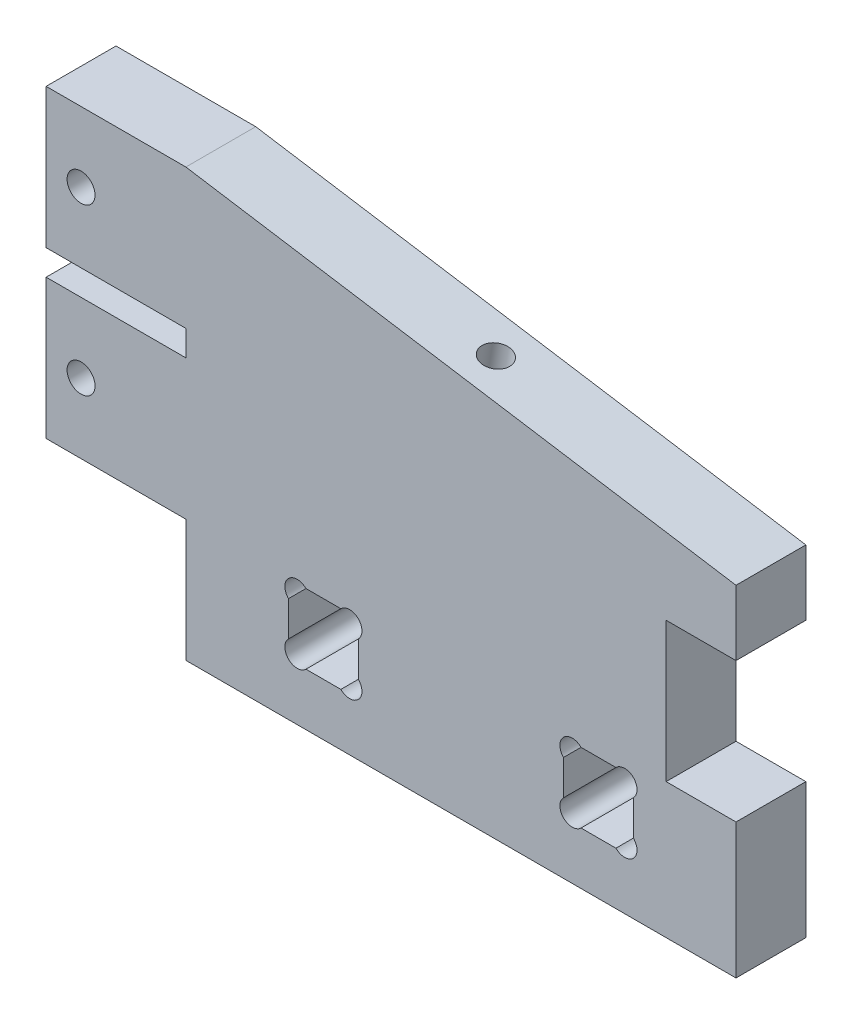
ISO-10303-21;
HEADER;
FILE_DESCRIPTION(('STEP AP214'),'2;1');
FILE_NAME('part.step','',(''),(''),'','','');
FILE_SCHEMA(('AUTOMOTIVE_DESIGN { 1 0 10303 214 1 1 1 1 }'));
ENDSEC;
DATA;
#1=APPLICATION_CONTEXT('core data for automotive mechanical design processes');
#2=APPLICATION_PROTOCOL_DEFINITION('international standard','automotive_design',2000,#1);
#3=PRODUCT_CONTEXT('',#1,'mechanical');
#4=PRODUCT('Part','Part','',(#3));
#5=PRODUCT_RELATED_PRODUCT_CATEGORY('part','',(#4));
#6=PRODUCT_DEFINITION_FORMATION('','',#4);
#7=PRODUCT_DEFINITION_CONTEXT('part definition',#1,'design');
#8=PRODUCT_DEFINITION('design','',#6,#7);
#9=PRODUCT_DEFINITION_SHAPE('','',#8);
#10=(LENGTH_UNIT() NAMED_UNIT(*) SI_UNIT(.MILLI.,.METRE.));
#11=(NAMED_UNIT(*) PLANE_ANGLE_UNIT() SI_UNIT($,.RADIAN.));
#12=(NAMED_UNIT(*) SI_UNIT($,.STERADIAN.) SOLID_ANGLE_UNIT());
#13=UNCERTAINTY_MEASURE_WITH_UNIT(LENGTH_MEASURE(1.E-05),#10,'distance_accuracy_value','');
#14=(GEOMETRIC_REPRESENTATION_CONTEXT(3) GLOBAL_UNCERTAINTY_ASSIGNED_CONTEXT((#13)) GLOBAL_UNIT_ASSIGNED_CONTEXT((#10,
#11,#12)) REPRESENTATION_CONTEXT('',''));
#15=CARTESIAN_POINT('',(0.,0.,0.));
#16=DIRECTION('',(0.,0.,1.));
#17=DIRECTION('',(1.,0.,0.));
#18=AXIS2_PLACEMENT_3D('',#15,#16,#17);
#19=CARTESIAN_POINT('',(131.75,-68.1416015166534,12.7));
#20=DIRECTION('',(-1.,0.,0.));
#21=DIRECTION('',(0.,0.,1.));
#22=AXIS2_PLACEMENT_3D('',#19,#20,#21);
#23=PLANE('',#22);
#24=DIRECTION('',(0.,1.,0.));
#25=VECTOR('',#24,1.);
#26=CARTESIAN_POINT('',(131.75,-68.1416015166534,12.7));
#27=LINE('',#26,#25);
#28=CARTESIAN_POINT('',(131.75,-27.7023135061397,12.7));
#29=VERTEX_POINT('',#28);
#30=CARTESIAN_POINT('',(131.75,-15.8384440324533,12.7));
#31=VERTEX_POINT('',#30);
#32=EDGE_CURVE('E667',#29,#31,#27,.T.);
#33=ORIENTED_EDGE('',*,*,#32,.F.);
#34=DIRECTION('',(0.,0.,1.));
#35=VECTOR('',#34,1.);
#36=CARTESIAN_POINT('',(131.75,-27.7023135061397,0.));
#37=LINE('',#36,#35);
#38=CARTESIAN_POINT('',(131.75,-27.7023135061397,0.));
#39=VERTEX_POINT('',#38);
#40=EDGE_CURVE('E421',#39,#29,#37,.T.);
#41=ORIENTED_EDGE('',*,*,#40,.F.);
#42=DIRECTION('',(0.,1.,0.));
#43=VECTOR('',#42,1.);
#44=CARTESIAN_POINT('',(131.75,-68.1416015166534,0.));
#45=LINE('',#44,#43);
#46=CARTESIAN_POINT('',(131.75,-15.8384440324533,0.));
#47=VERTEX_POINT('',#46);
#48=EDGE_CURVE('E693',#39,#47,#45,.T.);
#49=ORIENTED_EDGE('',*,*,#48,.T.);
#50=DIRECTION('',(0.,0.,-1.));
#51=VECTOR('',#50,1.);
#52=CARTESIAN_POINT('',(131.75,-15.8384440324533,12.7));
#53=LINE('',#52,#51);
#54=EDGE_CURVE('E183',#31,#47,#53,.T.);
#55=ORIENTED_EDGE('',*,*,#54,.F.);
#56=EDGE_LOOP('',(#33,#41,#49,#55));
#57=FACE_BOUND('',#56,.T.);
#58=ADVANCED_FACE('F174',(#57),#23,.F.);
#59=CARTESIAN_POINT('',(0.,-55.441182979826,12.7));
#60=DIRECTION('',(0.,1.,0.));
#61=DIRECTION('',(0.,0.,1.));
#62=AXIS2_PLACEMENT_3D('',#59,#60,#61);
#63=PLANE('',#62);
#64=DIRECTION('',(1.,0.,0.));
#65=VECTOR('',#64,1.);
#66=CARTESIAN_POINT('',(0.,-55.441182979826,12.7));
#67=LINE('',#66,#65);
#68=CARTESIAN_POINT('',(6.35000000000006,-55.441182979826,12.7));
#69=VERTEX_POINT('',#68);
#70=CARTESIAN_POINT('',(31.7500000000001,-55.441182979826,12.7));
#71=VERTEX_POINT('',#70);
#72=EDGE_CURVE('E660',#69,#71,#67,.T.);
#73=ORIENTED_EDGE('',*,*,#72,.F.);
#74=DIRECTION('',(0.,0.,1.));
#75=VECTOR('',#74,1.);
#76=CARTESIAN_POINT('',(6.35000000000006,-55.441182979826,-28.3980633142473));
#77=LINE('',#76,#75);
#78=CARTESIAN_POINT('',(6.35000000000006,-55.441182979826,0.));
#79=VERTEX_POINT('',#78);
#80=EDGE_CURVE('E430',#79,#69,#77,.T.);
#81=ORIENTED_EDGE('',*,*,#80,.F.);
#82=DIRECTION('',(1.,0.,0.));
#83=VECTOR('',#82,1.);
#84=CARTESIAN_POINT('',(0.,-55.441182979826,0.));
#85=LINE('',#84,#83);
#86=CARTESIAN_POINT('',(31.7500000000001,-55.441182979826,0.));
#87=VERTEX_POINT('',#86);
#88=EDGE_CURVE('E659',#79,#87,#85,.T.);
#89=ORIENTED_EDGE('',*,*,#88,.T.);
#90=DIRECTION('',(0.,0.,-1.));
#91=VECTOR('',#90,1.);
#92=CARTESIAN_POINT('',(31.7500000000001,-55.441182979826,12.7));
#93=LINE('',#92,#91);
#94=EDGE_CURVE('E12',#71,#87,#93,.T.);
#95=ORIENTED_EDGE('',*,*,#94,.F.);
#96=EDGE_LOOP('',(#73,#81,#89,#95));
#97=FACE_BOUND('',#96,.T.);
#98=ADVANCED_FACE('F176',(#97),#63,.F.);
#99=CARTESIAN_POINT('',(31.7500000000001,-68.1416015166534,12.7));
#100=DIRECTION('',(1.,0.,0.));
#101=DIRECTION('',(0.,0.,-1.));
#102=AXIS2_PLACEMENT_3D('',#99,#100,#101);
#103=PLANE('',#102);
#104=DIRECTION('',(0.,-1.,0.));
#105=VECTOR('',#104,1.);
#106=CARTESIAN_POINT('',(31.7500000000001,-68.1416015166534,0.));
#107=LINE('',#106,#105);
#108=CARTESIAN_POINT('',(31.7500000000001,-77.666182979826,0.));
#109=VERTEX_POINT('',#108);
#110=EDGE_CURVE('E690',#87,#109,#107,.T.);
#111=ORIENTED_EDGE('',*,*,#110,.T.);
#112=DIRECTION('',(0.,0.,1.));
#113=VECTOR('',#112,1.);
#114=CARTESIAN_POINT('',(31.7500000000001,-77.666182979826,-100.452603873668));
#115=LINE('',#114,#113);
#116=CARTESIAN_POINT('',(31.7500000000001,-77.666182979826,12.7));
#117=VERTEX_POINT('',#116);
#118=EDGE_CURVE('E655',#109,#117,#115,.T.);
#119=ORIENTED_EDGE('',*,*,#118,.T.);
#120=DIRECTION('',(0.,-1.,0.));
#121=VECTOR('',#120,1.);
#122=CARTESIAN_POINT('',(31.7500000000001,-68.1416015166534,12.7));
#123=LINE('',#122,#121);
#124=EDGE_CURVE('E663',#71,#117,#123,.T.);
#125=ORIENTED_EDGE('',*,*,#124,.F.);
#126=ORIENTED_EDGE('',*,*,#94,.T.);
#127=EDGE_LOOP('',(#111,#119,#125,#126));
#128=FACE_BOUND('',#127,.T.);
#129=ADVANCED_FACE('F758',(#128),#103,.F.);
#130=CARTESIAN_POINT('',(131.75,-77.666182979826,0.));
#131=VERTEX_POINT('',#130);
#132=CARTESIAN_POINT('',(131.75,-53.1023135061397,0.));
#133=VERTEX_POINT('',#132);
#134=EDGE_CURVE('E694',#131,#133,#45,.T.);
#135=ORIENTED_EDGE('',*,*,#134,.T.);
#136=DIRECTION('',(0.,0.,1.));
#137=VECTOR('',#136,1.);
#138=CARTESIAN_POINT('',(131.75,-53.1023135061397,0.));
#139=LINE('',#138,#137);
#140=CARTESIAN_POINT('',(131.75,-53.1023135061397,12.7));
#141=VERTEX_POINT('',#140);
#142=EDGE_CURVE('E190',#133,#141,#139,.T.);
#143=ORIENTED_EDGE('',*,*,#142,.T.);
#144=CARTESIAN_POINT('',(131.75,-77.666182979826,12.7));
#145=VERTEX_POINT('',#144);
#146=EDGE_CURVE('E668',#145,#141,#27,.T.);
#147=ORIENTED_EDGE('',*,*,#146,.F.);
#148=DIRECTION('',(0.,0.,1.));
#149=VECTOR('',#148,1.);
#150=CARTESIAN_POINT('',(131.75,-77.666182979826,-100.452603873668));
#151=LINE('',#150,#149);
#152=EDGE_CURVE('E651',#131,#145,#151,.T.);
#153=ORIENTED_EDGE('',*,*,#152,.F.);
#154=EDGE_LOOP('',(#135,#143,#147,#153));
#155=FACE_BOUND('',#154,.T.);
#156=ADVANCED_FACE('F748',(#155),#23,.F.);
#157=CARTESIAN_POINT('',(131.75,-15.8384440324533,12.7));
#158=DIRECTION('',(-0.156434465040228,-0.987688340595138,0.));
#159=DIRECTION('',(0.987688340595138,-0.156434465040228,0.));
#160=AXIS2_PLACEMENT_3D('',#157,#158,#159);
#161=PLANE('',#160);
#162=CARTESIAN_POINT('',(81.7500000000001,-7.91922201622666,6.35));
#163=DIRECTION('',(0.156434465040228,0.987688340595138,0.));
#164=DIRECTION('',(-0.987688340595138,0.156434465040228,0.));
#165=AXIS2_PLACEMENT_3D('',#162,#163,#164);
#166=CIRCLE('',#165,2.53999999999999);
#167=CARTESIAN_POINT('',(79.2412716148884,-7.52187847502448,6.35));
#168=VERTEX_POINT('',#167);
#169=EDGE_CURVE('E405',#168,#168,#166,.T.);
#170=ORIENTED_EDGE('',*,*,#169,.F.);
#171=EDGE_LOOP('',(#170));
#172=FACE_BOUND('',#171,.T.);
#173=DIRECTION('',(-0.987688340595138,0.156434465040228,0.));
#174=VECTOR('',#173,1.);
#175=CARTESIAN_POINT('',(131.75,-15.8384440324533,0.));
#176=LINE('',#175,#174);
#177=CARTESIAN_POINT('',(31.7500000000001,0.,0.));
#178=VERTEX_POINT('',#177);
#179=EDGE_CURVE('E697',#47,#178,#176,.T.);
#180=ORIENTED_EDGE('',*,*,#179,.T.);
#181=DIRECTION('',(0.,0.,-1.));
#182=VECTOR('',#181,1.);
#183=CARTESIAN_POINT('',(31.7500000000001,0.,12.7));
#184=LINE('',#183,#182);
#185=CARTESIAN_POINT('',(31.7500000000001,0.,12.7));
#186=VERTEX_POINT('',#185);
#187=EDGE_CURVE('E720',#186,#178,#184,.T.);
#188=ORIENTED_EDGE('',*,*,#187,.F.);
#189=DIRECTION('',(-0.987688340595138,0.156434465040228,0.));
#190=VECTOR('',#189,1.);
#191=CARTESIAN_POINT('',(131.75,-15.8384440324533,12.7));
#192=LINE('',#191,#190);
#193=EDGE_CURVE('E672',#31,#186,#192,.T.);
#194=ORIENTED_EDGE('',*,*,#193,.F.);
#195=ORIENTED_EDGE('',*,*,#54,.T.);
#196=EDGE_LOOP('',(#180,#188,#194,#195));
#197=FACE_BOUND('',#196,.T.);
#198=ADVANCED_FACE('F729',(#172,#197),#161,.F.);
#199=CARTESIAN_POINT('',(19.0500000000001,0.,12.7));
#200=DIRECTION('',(0.,-1.,0.));
#201=DIRECTION('',(0.,0.,-1.));
#202=AXIS2_PLACEMENT_3D('',#199,#200,#201);
#203=PLANE('',#202);
#204=DIRECTION('',(-1.,0.,0.));
#205=VECTOR('',#204,1.);
#206=CARTESIAN_POINT('',(19.0500000000001,0.,0.));
#207=LINE('',#206,#205);
#208=CARTESIAN_POINT('',(6.35000000000006,0.,0.));
#209=VERTEX_POINT('',#208);
#210=EDGE_CURVE('E701',#178,#209,#207,.T.);
#211=ORIENTED_EDGE('',*,*,#210,.T.);
#212=DIRECTION('',(0.,0.,1.));
#213=VECTOR('',#212,1.);
#214=CARTESIAN_POINT('',(6.35000000000006,0.,-28.3980633142473));
#215=LINE('',#214,#213);
#216=CARTESIAN_POINT('',(6.35000000000006,0.,12.7));
#217=VERTEX_POINT('',#216);
#218=EDGE_CURVE('E461',#209,#217,#215,.T.);
#219=ORIENTED_EDGE('',*,*,#218,.T.);
#220=DIRECTION('',(-1.,0.,0.));
#221=VECTOR('',#220,1.);
#222=CARTESIAN_POINT('',(31.7500000000001,0.,12.7));
#223=LINE('',#222,#221);
#224=EDGE_CURVE('E675',#186,#217,#223,.T.);
#225=ORIENTED_EDGE('',*,*,#224,.F.);
#226=ORIENTED_EDGE('',*,*,#187,.T.);
#227=EDGE_LOOP('',(#211,#219,#225,#226));
#228=FACE_BOUND('',#227,.T.);
#229=ADVANCED_FACE('F736',(#228),#203,.F.);
#230=CARTESIAN_POINT('',(31.7500000000001,-25.4,12.7));
#231=DIRECTION('',(0.,1.,0.));
#232=DIRECTION('',(0.,0.,1.));
#233=AXIS2_PLACEMENT_3D('',#230,#231,#232);
#234=PLANE('',#233);
#235=DIRECTION('',(1.,0.,0.));
#236=VECTOR('',#235,1.);
#237=CARTESIAN_POINT('',(19.0500000000001,-25.4,12.7));
#238=LINE('',#237,#236);
#239=CARTESIAN_POINT('',(6.35000000000006,-25.4,12.7));
#240=VERTEX_POINT('',#239);
#241=CARTESIAN_POINT('',(31.7500000000001,-25.4,12.7));
#242=VERTEX_POINT('',#241);
#243=EDGE_CURVE('E678',#240,#242,#238,.T.);
#244=ORIENTED_EDGE('',*,*,#243,.F.);
#245=DIRECTION('',(0.,0.,1.));
#246=VECTOR('',#245,1.);
#247=CARTESIAN_POINT('',(6.35000000000006,-25.4,-28.3980633142473));
#248=LINE('',#247,#246);
#249=CARTESIAN_POINT('',(6.35000000000006,-25.4,0.));
#250=VERTEX_POINT('',#249);
#251=EDGE_CURVE('E466',#250,#240,#248,.T.);
#252=ORIENTED_EDGE('',*,*,#251,.F.);
#253=DIRECTION('',(1.,0.,0.));
#254=VECTOR('',#253,1.);
#255=CARTESIAN_POINT('',(31.7500000000001,-25.4,0.));
#256=LINE('',#255,#254);
#257=CARTESIAN_POINT('',(31.7500000000001,-25.4,0.));
#258=VERTEX_POINT('',#257);
#259=EDGE_CURVE('E704',#250,#258,#256,.T.);
#260=ORIENTED_EDGE('',*,*,#259,.T.);
#261=DIRECTION('',(0.,0.,-1.));
#262=VECTOR('',#261,1.);
#263=CARTESIAN_POINT('',(31.7500000000001,-25.4,12.7));
#264=LINE('',#263,#262);
#265=EDGE_CURVE('E716',#242,#258,#264,.T.);
#266=ORIENTED_EDGE('',*,*,#265,.F.);
#267=EDGE_LOOP('',(#244,#252,#260,#266));
#268=FACE_BOUND('',#267,.T.);
#269=ADVANCED_FACE('F778',(#268),#234,.F.);
#270=CARTESIAN_POINT('',(31.7500000000001,-30.041182979826,12.7));
#271=DIRECTION('',(1.,0.,0.));
#272=DIRECTION('',(0.,0.,-1.));
#273=AXIS2_PLACEMENT_3D('',#270,#271,#272);
#274=PLANE('',#273);
#275=DIRECTION('',(0.,-1.,0.));
#276=VECTOR('',#275,1.);
#277=CARTESIAN_POINT('',(31.7500000000001,-30.041182979826,0.));
#278=LINE('',#277,#276);
#279=CARTESIAN_POINT('',(31.7500000000001,-30.041182979826,0.));
#280=VERTEX_POINT('',#279);
#281=EDGE_CURVE('E707',#258,#280,#278,.T.);
#282=ORIENTED_EDGE('',*,*,#281,.T.);
#283=DIRECTION('',(0.,0.,-1.));
#284=VECTOR('',#283,1.);
#285=CARTESIAN_POINT('',(31.7500000000001,-30.041182979826,12.7));
#286=LINE('',#285,#284);
#287=CARTESIAN_POINT('',(31.7500000000001,-30.041182979826,12.7));
#288=VERTEX_POINT('',#287);
#289=EDGE_CURVE('E687',#288,#280,#286,.T.);
#290=ORIENTED_EDGE('',*,*,#289,.F.);
#291=DIRECTION('',(0.,-1.,0.));
#292=VECTOR('',#291,1.);
#293=CARTESIAN_POINT('',(31.7500000000001,-30.041182979826,12.7));
#294=LINE('',#293,#292);
#295=EDGE_CURVE('E681',#242,#288,#294,.T.);
#296=ORIENTED_EDGE('',*,*,#295,.F.);
#297=ORIENTED_EDGE('',*,*,#265,.T.);
#298=EDGE_LOOP('',(#282,#290,#296,#297));
#299=FACE_BOUND('',#298,.T.);
#300=ADVANCED_FACE('F774',(#299),#274,.F.);
#301=CARTESIAN_POINT('',(0.,-30.041182979826,12.7));
#302=DIRECTION('',(0.,-1.,0.));
#303=DIRECTION('',(0.,0.,-1.));
#304=AXIS2_PLACEMENT_3D('',#301,#302,#303);
#305=PLANE('',#304);
#306=DIRECTION('',(-1.,0.,0.));
#307=VECTOR('',#306,1.);
#308=CARTESIAN_POINT('',(0.,-30.041182979826,0.));
#309=LINE('',#308,#307);
#310=CARTESIAN_POINT('',(6.35000000000006,-30.041182979826,0.));
#311=VERTEX_POINT('',#310);
#312=EDGE_CURVE('E664',#280,#311,#309,.T.);
#313=ORIENTED_EDGE('',*,*,#312,.T.);
#314=DIRECTION('',(0.,0.,1.));
#315=VECTOR('',#314,1.);
#316=CARTESIAN_POINT('',(6.35000000000006,-30.041182979826,-28.3980633142473));
#317=LINE('',#316,#315);
#318=CARTESIAN_POINT('',(6.35000000000006,-30.041182979826,12.7));
#319=VERTEX_POINT('',#318);
#320=EDGE_CURVE('E442',#311,#319,#317,.T.);
#321=ORIENTED_EDGE('',*,*,#320,.T.);
#322=DIRECTION('',(-1.,0.,0.));
#323=VECTOR('',#322,1.);
#324=CARTESIAN_POINT('',(19.0500000000001,-30.041182979826,12.7));
#325=LINE('',#324,#323);
#326=EDGE_CURVE('E684',#288,#319,#325,.T.);
#327=ORIENTED_EDGE('',*,*,#326,.F.);
#328=ORIENTED_EDGE('',*,*,#289,.T.);
#329=EDGE_LOOP('',(#313,#321,#327,#328));
#330=FACE_BOUND('',#329,.T.);
#331=ADVANCED_FACE('F770',(#330),#305,.F.);
#332=CARTESIAN_POINT('',(0.,0.,12.7));
#333=DIRECTION('',(0.,0.,-1.));
#334=DIRECTION('',(-1.,0.,0.));
#335=AXIS2_PLACEMENT_3D('',#332,#333,#334);
#336=PLANE('',#335);
#337=CARTESIAN_POINT('',(12.7000000000001,-12.7,12.7));
#338=DIRECTION('',(0.,0.,1.));
#339=DIRECTION('',(1.,0.,0.));
#340=AXIS2_PLACEMENT_3D('',#337,#338,#339);
#341=CIRCLE('',#340,2.54);
#342=CARTESIAN_POINT('',(15.2400000000001,-12.7,12.7));
#343=VERTEX_POINT('',#342);
#344=EDGE_CURVE('E431',#343,#343,#341,.T.);
#345=ORIENTED_EDGE('',*,*,#344,.F.);
#346=EDGE_LOOP('',(#345));
#347=FACE_BOUND('',#346,.T.);
#348=CARTESIAN_POINT('',(12.7000000000001,-42.741182979826,12.7));
#349=DIRECTION('',(0.,0.,1.));
#350=DIRECTION('',(-1.,0.,0.));
#351=AXIS2_PLACEMENT_3D('',#348,#349,#350);
#352=CIRCLE('',#351,2.54);
#353=CARTESIAN_POINT('',(10.1600000000001,-42.741182979826,12.7));
#354=VERTEX_POINT('',#353);
#355=EDGE_CURVE('E435',#354,#354,#352,.T.);
#356=ORIENTED_EDGE('',*,*,#355,.F.);
#357=EDGE_LOOP('',(#356));
#358=FACE_BOUND('',#357,.T.);
#359=DIRECTION('',(0.,1.,0.));
#360=VECTOR('',#359,1.);
#361=CARTESIAN_POINT('',(63.1,0.,12.7));
#362=LINE('',#361,#360);
#363=CARTESIAN_POINT('',(63.1,-64.9657644429986,12.7));
#364=VERTEX_POINT('',#363);
#365=CARTESIAN_POINT('',(63.1,-58.6166015166534,12.7));
#366=VERTEX_POINT('',#365);
#367=EDGE_CURVE('E198',#364,#366,#362,.T.);
#368=ORIENTED_EDGE('',*,*,#367,.F.);
#369=CARTESIAN_POINT('',(61.5125000000001,-66.553682979826,12.7));
#370=DIRECTION('',(0.,0.,1.));
#371=DIRECTION('',(1.,0.,0.));
#372=AXIS2_PLACEMENT_3D('',#369,#370,#371);
#373=CIRCLE('',#372,2.24535999999999);
#374=CARTESIAN_POINT('',(59.9245814631727,-68.141182979826,12.7));
#375=VERTEX_POINT('',#374);
#376=EDGE_CURVE('E513',#375,#364,#373,.T.);
#377=ORIENTED_EDGE('',*,*,#376,.F.);
#378=DIRECTION('',(-1.,0.,0.));
#379=VECTOR('',#378,1.);
#380=CARTESIAN_POINT('',(-1.48921083207477E-13,-68.1411829798259,12.7));
#381=LINE('',#380,#379);
#382=CARTESIAN_POINT('',(53.5754185368274,-68.141182979826,12.7));
#383=VERTEX_POINT('',#382);
#384=EDGE_CURVE('E509',#375,#383,#381,.T.);
#385=ORIENTED_EDGE('',*,*,#384,.T.);
#386=CARTESIAN_POINT('',(51.9875,-66.553682979826,12.7));
#387=DIRECTION('',(0.,0.,1.));
#388=DIRECTION('',(1.,0.,0.));
#389=AXIS2_PLACEMENT_3D('',#386,#387,#388);
#390=CIRCLE('',#389,2.24536);
#391=CARTESIAN_POINT('',(50.4,-64.9657644429986,12.7));
#392=VERTEX_POINT('',#391);
#393=EDGE_CURVE('E504',#383,#392,#390,.F.);
#394=ORIENTED_EDGE('',*,*,#393,.T.);
#395=DIRECTION('',(0.,1.,0.));
#396=VECTOR('',#395,1.);
#397=CARTESIAN_POINT('',(50.4,0.,12.7));
#398=LINE('',#397,#396);
#399=CARTESIAN_POINT('',(50.4,-58.6166015166534,12.7));
#400=VERTEX_POINT('',#399);
#401=EDGE_CURVE('E500',#392,#400,#398,.T.);
#402=ORIENTED_EDGE('',*,*,#401,.T.);
#403=CARTESIAN_POINT('',(51.9875,-57.028682979826,12.7));
#404=DIRECTION('',(0.,0.,1.));
#405=DIRECTION('',(1.,0.,0.));
#406=AXIS2_PLACEMENT_3D('',#403,#404,#405);
#407=CIRCLE('',#406,2.24536);
#408=CARTESIAN_POINT('',(53.5754185368274,-55.441182979826,12.7));
#409=VERTEX_POINT('',#408);
#410=EDGE_CURVE('E478',#409,#400,#407,.T.);
#411=ORIENTED_EDGE('',*,*,#410,.F.);
#412=DIRECTION('',(1.,0.,0.));
#413=VECTOR('',#412,1.);
#414=CARTESIAN_POINT('',(-1.21165507591849E-13,-55.4411829798259,12.7));
#415=LINE('',#414,#413);
#416=CARTESIAN_POINT('',(59.9245814631727,-55.441182979826,12.7));
#417=VERTEX_POINT('',#416);
#418=EDGE_CURVE('E519',#409,#417,#415,.T.);
#419=ORIENTED_EDGE('',*,*,#418,.T.);
#420=CARTESIAN_POINT('',(61.5125000000001,-57.028682979826,12.7));
#421=DIRECTION('',(0.,0.,-1.));
#422=DIRECTION('',(-1.,0.,0.));
#423=AXIS2_PLACEMENT_3D('',#420,#421,#422);
#424=CIRCLE('',#423,2.24535999999999);
#425=EDGE_CURVE('E547',#417,#366,#424,.T.);
#426=ORIENTED_EDGE('',*,*,#425,.T.);
#427=EDGE_LOOP('',(#368,#377,#385,#394,#402,#411,#419,#426));
#428=FACE_BOUND('',#427,.T.);
#429=DIRECTION('',(0.,1.,0.));
#430=VECTOR('',#429,1.);
#431=CARTESIAN_POINT('',(113.1,0.,12.7));
#432=LINE('',#431,#430);
#433=CARTESIAN_POINT('',(113.1,-64.9657644429986,12.7));
#434=VERTEX_POINT('',#433);
#435=CARTESIAN_POINT('',(113.1,-58.6166015166534,12.7));
#436=VERTEX_POINT('',#435);
#437=EDGE_CURVE('E589',#434,#436,#432,.T.);
#438=ORIENTED_EDGE('',*,*,#437,.F.);
#439=CARTESIAN_POINT('',(111.5125,-66.553682979826,12.7));
#440=DIRECTION('',(0.,0.,1.));
#441=DIRECTION('',(1.,0.,0.));
#442=AXIS2_PLACEMENT_3D('',#439,#440,#441);
#443=CIRCLE('',#442,2.24536);
#444=CARTESIAN_POINT('',(109.924581463173,-68.141182979826,12.7));
#445=VERTEX_POINT('',#444);
#446=EDGE_CURVE('E551',#445,#434,#443,.T.);
#447=ORIENTED_EDGE('',*,*,#446,.F.);
#448=DIRECTION('',(-1.,0.,0.));
#449=VECTOR('',#448,1.);
#450=CARTESIAN_POINT('',(-1.48921083207477E-13,-68.1411829798258,12.7));
#451=LINE('',#450,#449);
#452=CARTESIAN_POINT('',(103.575418536827,-68.141182979826,12.7));
#453=VERTEX_POINT('',#452);
#454=EDGE_CURVE('E615',#445,#453,#451,.T.);
#455=ORIENTED_EDGE('',*,*,#454,.T.);
#456=CARTESIAN_POINT('',(101.9875,-66.553682979826,12.7));
#457=DIRECTION('',(0.,0.,-1.));
#458=DIRECTION('',(-1.,0.,0.));
#459=AXIS2_PLACEMENT_3D('',#456,#457,#458);
#460=CIRCLE('',#459,2.24536);
#461=CARTESIAN_POINT('',(100.4,-64.9657644429986,12.7));
#462=VERTEX_POINT('',#461);
#463=EDGE_CURVE('E565',#453,#462,#460,.T.);
#464=ORIENTED_EDGE('',*,*,#463,.T.);
#465=DIRECTION('',(0.,1.,0.));
#466=VECTOR('',#465,1.);
#467=CARTESIAN_POINT('',(100.4,0.,12.7));
#468=LINE('',#467,#466);
#469=CARTESIAN_POINT('',(100.4,-58.6166015166534,12.7));
#470=VERTEX_POINT('',#469);
#471=EDGE_CURVE('E619',#462,#470,#468,.T.);
#472=ORIENTED_EDGE('',*,*,#471,.T.);
#473=CARTESIAN_POINT('',(101.9875,-57.028682979826,12.7));
#474=DIRECTION('',(0.,0.,1.));
#475=DIRECTION('',(1.,0.,0.));
#476=AXIS2_PLACEMENT_3D('',#473,#474,#475);
#477=CIRCLE('',#476,2.24536);
#478=CARTESIAN_POINT('',(103.575418536827,-55.441182979826,12.7));
#479=VERTEX_POINT('',#478);
#480=EDGE_CURVE('E581',#479,#470,#477,.T.);
#481=ORIENTED_EDGE('',*,*,#480,.F.);
#482=DIRECTION('',(1.,0.,0.));
#483=VECTOR('',#482,1.);
#484=CARTESIAN_POINT('',(-2.42331015183695E-13,-55.4411829798256,12.7));
#485=LINE('',#484,#483);
#486=CARTESIAN_POINT('',(109.924581463173,-55.441182979826,12.7));
#487=VERTEX_POINT('',#486);
#488=EDGE_CURVE('E624',#479,#487,#485,.T.);
#489=ORIENTED_EDGE('',*,*,#488,.T.);
#490=CARTESIAN_POINT('',(111.5125,-57.028682979826,12.7));
#491=DIRECTION('',(0.,0.,-1.));
#492=DIRECTION('',(-1.,0.,0.));
#493=AXIS2_PLACEMENT_3D('',#490,#491,#492);
#494=CIRCLE('',#493,2.24536);
#495=EDGE_CURVE('E573',#487,#436,#494,.T.);
#496=ORIENTED_EDGE('',*,*,#495,.T.);
#497=EDGE_LOOP('',(#438,#447,#455,#464,#472,#481,#489,#496));
#498=FACE_BOUND('',#497,.T.);
#499=DIRECTION('',(0.,1.,0.));
#500=VECTOR('',#499,1.);
#501=CARTESIAN_POINT('',(119.05,-46.7523135061397,12.7));
#502=LINE('',#501,#500);
#503=CARTESIAN_POINT('',(119.05,-53.1023135061397,12.7));
#504=VERTEX_POINT('',#503);
#505=CARTESIAN_POINT('',(119.05,-27.7023135061397,12.7));
#506=VERTEX_POINT('',#505);
#507=EDGE_CURVE('E384',#504,#506,#502,.T.);
#508=ORIENTED_EDGE('',*,*,#507,.T.);
#509=DIRECTION('',(-1.,0.,0.));
#510=VECTOR('',#509,1.);
#511=CARTESIAN_POINT('',(131.75,-27.7023135061397,12.7));
#512=LINE('',#511,#510);
#513=EDGE_CURVE('E402',#29,#506,#512,.T.);
#514=ORIENTED_EDGE('',*,*,#513,.F.);
#515=ORIENTED_EDGE('',*,*,#32,.T.);
#516=ORIENTED_EDGE('',*,*,#193,.T.);
#517=ORIENTED_EDGE('',*,*,#224,.T.);
#518=DIRECTION('',(0.,-1.,0.));
#519=VECTOR('',#518,1.);
#520=CARTESIAN_POINT('',(6.35000000000006,-25.4,12.7));
#521=LINE('',#520,#519);
#522=EDGE_CURVE('E457',#217,#240,#521,.T.);
#523=ORIENTED_EDGE('',*,*,#522,.T.);
#524=ORIENTED_EDGE('',*,*,#243,.T.);
#525=ORIENTED_EDGE('',*,*,#295,.T.);
#526=ORIENTED_EDGE('',*,*,#326,.T.);
#527=DIRECTION('',(0.,-1.,0.));
#528=VECTOR('',#527,1.);
#529=CARTESIAN_POINT('',(6.35000000000006,-30.041182979826,12.7));
#530=LINE('',#529,#528);
#531=EDGE_CURVE('E446',#319,#69,#530,.T.);
#532=ORIENTED_EDGE('',*,*,#531,.T.);
#533=ORIENTED_EDGE('',*,*,#72,.T.);
#534=ORIENTED_EDGE('',*,*,#124,.T.);
#535=DIRECTION('',(1.,0.,0.));
#536=VECTOR('',#535,1.);
#537=CARTESIAN_POINT('',(31.7500000000001,-77.666182979826,12.7));
#538=LINE('',#537,#536);
#539=EDGE_CURVE('E557',#117,#145,#538,.T.);
#540=ORIENTED_EDGE('',*,*,#539,.T.);
#541=ORIENTED_EDGE('',*,*,#146,.T.);
#542=DIRECTION('',(1.,0.,0.));
#543=VECTOR('',#542,1.);
#544=CARTESIAN_POINT('',(119.05,-53.1023135061397,12.7));
#545=LINE('',#544,#543);
#546=EDGE_CURVE('E410',#504,#141,#545,.T.);
#547=ORIENTED_EDGE('',*,*,#546,.F.);
#548=EDGE_LOOP('',(#508,#514,#515,#516,#517,#523,#524,#525,#526,#532,#533,#534,#540,#541,#547));
#549=FACE_BOUND('',#548,.T.);
#550=ADVANCED_FACE('F740',(#347,#358,#428,#498,#549),#336,.F.);
#551=CARTESIAN_POINT('',(0.,0.,0.));
#552=DIRECTION('',(0.,0.,-1.));
#553=DIRECTION('',(-1.,0.,0.));
#554=AXIS2_PLACEMENT_3D('',#551,#552,#553);
#555=PLANE('',#554);
#556=DIRECTION('',(-1.,0.,0.));
#557=VECTOR('',#556,1.);
#558=CARTESIAN_POINT('',(131.75,-27.7023135061397,0.));
#559=LINE('',#558,#557);
#560=CARTESIAN_POINT('',(119.05,-27.7023135061397,0.));
#561=VERTEX_POINT('',#560);
#562=EDGE_CURVE('E387',#39,#561,#559,.T.);
#563=ORIENTED_EDGE('',*,*,#562,.T.);
#564=DIRECTION('',(0.,-1.,0.));
#565=VECTOR('',#564,1.);
#566=CARTESIAN_POINT('',(119.05,-46.7523135061397,0.));
#567=LINE('',#566,#565);
#568=CARTESIAN_POINT('',(119.05,-53.1023135061397,0.));
#569=VERTEX_POINT('',#568);
#570=EDGE_CURVE('E381',#561,#569,#567,.T.);
#571=ORIENTED_EDGE('',*,*,#570,.T.);
#572=DIRECTION('',(1.,0.,0.));
#573=VECTOR('',#572,1.);
#574=CARTESIAN_POINT('',(119.05,-53.1023135061397,0.));
#575=LINE('',#574,#573);
#576=EDGE_CURVE('E389',#569,#133,#575,.T.);
#577=ORIENTED_EDGE('',*,*,#576,.T.);
#578=ORIENTED_EDGE('',*,*,#134,.F.);
#579=DIRECTION('',(1.,0.,0.));
#580=VECTOR('',#579,1.);
#581=CARTESIAN_POINT('',(31.7500000000001,-77.666182979826,0.));
#582=LINE('',#581,#580);
#583=EDGE_CURVE('E647',#109,#131,#582,.T.);
#584=ORIENTED_EDGE('',*,*,#583,.F.);
#585=ORIENTED_EDGE('',*,*,#110,.F.);
#586=ORIENTED_EDGE('',*,*,#88,.F.);
#587=DIRECTION('',(0.,-1.,0.));
#588=VECTOR('',#587,1.);
#589=CARTESIAN_POINT('',(6.35000000000006,-30.041182979826,0.));
#590=LINE('',#589,#588);
#591=EDGE_CURVE('E447',#311,#79,#590,.T.);
#592=ORIENTED_EDGE('',*,*,#591,.F.);
#593=ORIENTED_EDGE('',*,*,#312,.F.);
#594=ORIENTED_EDGE('',*,*,#281,.F.);
#595=ORIENTED_EDGE('',*,*,#259,.F.);
#596=DIRECTION('',(0.,-1.,0.));
#597=VECTOR('',#596,1.);
#598=CARTESIAN_POINT('',(6.35000000000006,-25.4,0.));
#599=LINE('',#598,#597);
#600=EDGE_CURVE('E462',#209,#250,#599,.T.);
#601=ORIENTED_EDGE('',*,*,#600,.F.);
#602=ORIENTED_EDGE('',*,*,#210,.F.);
#603=ORIENTED_EDGE('',*,*,#179,.F.);
#604=ORIENTED_EDGE('',*,*,#48,.F.);
#605=EDGE_LOOP('',(#563,#571,#577,#578,#584,#585,#586,#592,#593,#594,#595,#601,#602,#603,#604));
#606=FACE_BOUND('',#605,.T.);
#607=CARTESIAN_POINT('',(12.7000000000001,-12.7,0.));
#608=DIRECTION('',(0.,0.,1.));
#609=DIRECTION('',(1.,0.,0.));
#610=AXIS2_PLACEMENT_3D('',#607,#608,#609);
#611=CIRCLE('',#610,2.54);
#612=CARTESIAN_POINT('',(15.2400000000001,-12.7,0.));
#613=VERTEX_POINT('',#612);
#614=EDGE_CURVE('E426',#613,#613,#611,.T.);
#615=ORIENTED_EDGE('',*,*,#614,.T.);
#616=EDGE_LOOP('',(#615));
#617=FACE_BOUND('',#616,.T.);
#618=CARTESIAN_POINT('',(12.7000000000001,-42.741182979826,0.));
#619=DIRECTION('',(0.,0.,1.));
#620=DIRECTION('',(-1.,0.,0.));
#621=AXIS2_PLACEMENT_3D('',#618,#619,#620);
#622=CIRCLE('',#621,2.54);
#623=CARTESIAN_POINT('',(10.1600000000001,-42.741182979826,0.));
#624=VERTEX_POINT('',#623);
#625=EDGE_CURVE('E420',#624,#624,#622,.T.);
#626=ORIENTED_EDGE('',*,*,#625,.T.);
#627=EDGE_LOOP('',(#626));
#628=FACE_BOUND('',#627,.T.);
#629=CARTESIAN_POINT('',(61.5125000000001,-66.553682979826,0.));
#630=DIRECTION('',(0.,0.,1.));
#631=DIRECTION('',(1.,0.,0.));
#632=AXIS2_PLACEMENT_3D('',#629,#630,#631);
#633=CIRCLE('',#632,2.24535999999999);
#634=CARTESIAN_POINT('',(59.9245814631727,-68.141182979826,0.));
#635=VERTEX_POINT('',#634);
#636=CARTESIAN_POINT('',(63.1,-64.9657644429986,0.));
#637=VERTEX_POINT('',#636);
#638=EDGE_CURVE('E484',#635,#637,#633,.T.);
#639=ORIENTED_EDGE('',*,*,#638,.T.);
#640=DIRECTION('',(0.,1.,0.));
#641=VECTOR('',#640,1.);
#642=CARTESIAN_POINT('',(63.1,0.,0.));
#643=LINE('',#642,#641);
#644=CARTESIAN_POINT('',(63.1,-58.6166015166534,0.));
#645=VERTEX_POINT('',#644);
#646=EDGE_CURVE('E488',#637,#645,#643,.T.);
#647=ORIENTED_EDGE('',*,*,#646,.T.);
#648=CARTESIAN_POINT('',(61.5125000000001,-57.028682979826,0.));
#649=DIRECTION('',(0.,0.,-1.));
#650=DIRECTION('',(-1.,0.,0.));
#651=AXIS2_PLACEMENT_3D('',#648,#649,#650);
#652=CIRCLE('',#651,2.24535999999999);
#653=CARTESIAN_POINT('',(59.9245814631727,-55.441182979826,0.));
#654=VERTEX_POINT('',#653);
#655=EDGE_CURVE('E505',#654,#645,#652,.T.);
#656=ORIENTED_EDGE('',*,*,#655,.F.);
#657=DIRECTION('',(1.,0.,0.));
#658=VECTOR('',#657,1.);
#659=CARTESIAN_POINT('',(-1.21165507591849E-13,-55.4411829798259,0.));
#660=LINE('',#659,#658);
#661=CARTESIAN_POINT('',(53.5754185368274,-55.441182979826,0.));
#662=VERTEX_POINT('',#661);
#663=EDGE_CURVE('E492',#662,#654,#660,.T.);
#664=ORIENTED_EDGE('',*,*,#663,.F.);
#665=CARTESIAN_POINT('',(51.9875,-57.028682979826,0.));
#666=DIRECTION('',(0.,0.,1.));
#667=DIRECTION('',(1.,0.,0.));
#668=AXIS2_PLACEMENT_3D('',#665,#666,#667);
#669=CIRCLE('',#668,2.24536);
#670=CARTESIAN_POINT('',(50.4,-58.6166015166534,0.));
#671=VERTEX_POINT('',#670);
#672=EDGE_CURVE('E495',#662,#671,#669,.T.);
#673=ORIENTED_EDGE('',*,*,#672,.T.);
#674=DIRECTION('',(0.,1.,0.));
#675=VECTOR('',#674,1.);
#676=CARTESIAN_POINT('',(50.4,0.,0.));
#677=LINE('',#676,#675);
#678=CARTESIAN_POINT('',(50.4,-64.9657644429986,0.));
#679=VERTEX_POINT('',#678);
#680=EDGE_CURVE('E474',#679,#671,#677,.T.);
#681=ORIENTED_EDGE('',*,*,#680,.F.);
#682=CARTESIAN_POINT('',(51.9875,-66.553682979826,0.));
#683=DIRECTION('',(0.,0.,1.));
#684=DIRECTION('',(1.,0.,0.));
#685=AXIS2_PLACEMENT_3D('',#682,#683,#684);
#686=CIRCLE('',#685,2.24536);
#687=CARTESIAN_POINT('',(53.5754185368274,-68.141182979826,0.));
#688=VERTEX_POINT('',#687);
#689=EDGE_CURVE('E477',#688,#679,#686,.F.);
#690=ORIENTED_EDGE('',*,*,#689,.F.);
#691=DIRECTION('',(-1.,0.,0.));
#692=VECTOR('',#691,1.);
#693=CARTESIAN_POINT('',(-1.48921083207477E-13,-68.1411829798259,0.));
#694=LINE('',#693,#692);
#695=EDGE_CURVE('E481',#635,#688,#694,.T.);
#696=ORIENTED_EDGE('',*,*,#695,.F.);
#697=EDGE_LOOP('',(#639,#647,#656,#664,#673,#681,#690,#696));
#698=FACE_BOUND('',#697,.T.);
#699=CARTESIAN_POINT('',(111.5125,-66.553682979826,0.));
#700=DIRECTION('',(0.,0.,1.));
#701=DIRECTION('',(1.,0.,0.));
#702=AXIS2_PLACEMENT_3D('',#699,#700,#701);
#703=CIRCLE('',#702,2.24536);
#704=CARTESIAN_POINT('',(109.924581463173,-68.141182979826,0.));
#705=VERTEX_POINT('',#704);
#706=CARTESIAN_POINT('',(113.1,-64.9657644429986,0.));
#707=VERTEX_POINT('',#706);
#708=EDGE_CURVE('E561',#705,#707,#703,.T.);
#709=ORIENTED_EDGE('',*,*,#708,.T.);
#710=DIRECTION('',(0.,1.,0.));
#711=VECTOR('',#710,1.);
#712=CARTESIAN_POINT('',(113.1,0.,0.));
#713=LINE('',#712,#711);
#714=CARTESIAN_POINT('',(113.1,-58.6166015166534,0.));
#715=VERTEX_POINT('',#714);
#716=EDGE_CURVE('E620',#707,#715,#713,.T.);
#717=ORIENTED_EDGE('',*,*,#716,.T.);
#718=CARTESIAN_POINT('',(111.5125,-57.028682979826,0.));
#719=DIRECTION('',(0.,0.,-1.));
#720=DIRECTION('',(-1.,0.,0.));
#721=AXIS2_PLACEMENT_3D('',#718,#719,#720);
#722=CIRCLE('',#721,2.24536);
#723=CARTESIAN_POINT('',(109.924581463173,-55.441182979826,0.));
#724=VERTEX_POINT('',#723);
#725=EDGE_CURVE('E577',#724,#715,#722,.T.);
#726=ORIENTED_EDGE('',*,*,#725,.F.);
#727=DIRECTION('',(1.,0.,0.));
#728=VECTOR('',#727,1.);
#729=CARTESIAN_POINT('',(-2.42331015183695E-13,-55.4411829798256,0.));
#730=LINE('',#729,#728);
#731=CARTESIAN_POINT('',(103.575418536827,-55.441182979826,0.));
#732=VERTEX_POINT('',#731);
#733=EDGE_CURVE('E637',#732,#724,#730,.T.);
#734=ORIENTED_EDGE('',*,*,#733,.F.);
#735=CARTESIAN_POINT('',(101.9875,-57.028682979826,0.));
#736=DIRECTION('',(0.,0.,1.));
#737=DIRECTION('',(1.,0.,0.));
#738=AXIS2_PLACEMENT_3D('',#735,#736,#737);
#739=CIRCLE('',#738,2.24536);
#740=CARTESIAN_POINT('',(100.4,-58.6166015166534,0.));
#741=VERTEX_POINT('',#740);
#742=EDGE_CURVE('E585',#732,#741,#739,.T.);
#743=ORIENTED_EDGE('',*,*,#742,.T.);
#744=DIRECTION('',(0.,1.,0.));
#745=VECTOR('',#744,1.);
#746=CARTESIAN_POINT('',(100.4,0.,0.));
#747=LINE('',#746,#745);
#748=CARTESIAN_POINT('',(100.4,-64.9657644429986,0.));
#749=VERTEX_POINT('',#748);
#750=EDGE_CURVE('E634',#749,#741,#747,.T.);
#751=ORIENTED_EDGE('',*,*,#750,.F.);
#752=CARTESIAN_POINT('',(101.9875,-66.553682979826,0.));
#753=DIRECTION('',(0.,0.,-1.));
#754=DIRECTION('',(-1.,0.,0.));
#755=AXIS2_PLACEMENT_3D('',#752,#753,#754);
#756=CIRCLE('',#755,2.24536);
#757=CARTESIAN_POINT('',(103.575418536827,-68.141182979826,0.));
#758=VERTEX_POINT('',#757);
#759=EDGE_CURVE('E569',#758,#749,#756,.T.);
#760=ORIENTED_EDGE('',*,*,#759,.F.);
#761=DIRECTION('',(-1.,0.,0.));
#762=VECTOR('',#761,1.);
#763=CARTESIAN_POINT('',(-1.48921083207477E-13,-68.1411829798258,0.));
#764=LINE('',#763,#762);
#765=EDGE_CURVE('E593',#705,#758,#764,.T.);
#766=ORIENTED_EDGE('',*,*,#765,.F.);
#767=EDGE_LOOP('',(#709,#717,#726,#734,#743,#751,#760,#766));
#768=FACE_BOUND('',#767,.T.);
#769=ADVANCED_FACE('F396',(#606,#617,#628,#698,#768),#555,.T.);
#770=CARTESIAN_POINT('',(31.7500000000001,-77.666182979826,-100.452603873668));
#771=DIRECTION('',(0.,-1.,0.));
#772=DIRECTION('',(0.,0.,-1.));
#773=AXIS2_PLACEMENT_3D('',#770,#771,#772);
#774=PLANE('',#773);
#775=ORIENTED_EDGE('',*,*,#118,.F.);
#776=ORIENTED_EDGE('',*,*,#583,.T.);
#777=ORIENTED_EDGE('',*,*,#152,.T.);
#778=ORIENTED_EDGE('',*,*,#539,.F.);
#779=EDGE_LOOP('',(#775,#776,#777,#778));
#780=FACE_BOUND('',#779,.T.);
#781=ADVANCED_FACE('F755',(#780),#774,.T.);
#782=CARTESIAN_POINT('',(-1.48921083207477E-13,-68.1411829798258,0.));
#783=DIRECTION('',(0.,1.,0.));
#784=DIRECTION('',(-1.,0.,0.));
#785=AXIS2_PLACEMENT_3D('',#782,#783,#784);
#786=PLANE('',#785);
#787=ORIENTED_EDGE('',*,*,#454,.F.);
#788=DIRECTION('',(0.,0.,1.));
#789=VECTOR('',#788,1.);
#790=CARTESIAN_POINT('',(109.924581463173,-68.141182979826,0.));
#791=LINE('',#790,#789);
#792=EDGE_CURVE('E610',#705,#445,#791,.T.);
#793=ORIENTED_EDGE('',*,*,#792,.F.);
#794=ORIENTED_EDGE('',*,*,#765,.T.);
#795=DIRECTION('',(0.,0.,1.));
#796=VECTOR('',#795,1.);
#797=CARTESIAN_POINT('',(103.575418536827,-68.141182979826,0.));
#798=LINE('',#797,#796);
#799=EDGE_CURVE('E607',#758,#453,#798,.T.);
#800=ORIENTED_EDGE('',*,*,#799,.T.);
#801=EDGE_LOOP('',(#787,#793,#794,#800));
#802=FACE_BOUND('',#801,.T.);
#803=ADVANCED_FACE('F1059',(#802),#786,.T.);
#804=CARTESIAN_POINT('',(100.4,0.,0.));
#805=DIRECTION('',(1.,0.,0.));
#806=DIRECTION('',(0.,0.,-1.));
#807=AXIS2_PLACEMENT_3D('',#804,#805,#806);
#808=PLANE('',#807);
#809=ORIENTED_EDGE('',*,*,#471,.F.);
#810=DIRECTION('',(0.,0.,1.));
#811=VECTOR('',#810,1.);
#812=CARTESIAN_POINT('',(100.4,-64.9657644429986,0.));
#813=LINE('',#812,#811);
#814=EDGE_CURVE('E604',#749,#462,#813,.T.);
#815=ORIENTED_EDGE('',*,*,#814,.F.);
#816=ORIENTED_EDGE('',*,*,#750,.T.);
#817=DIRECTION('',(0.,0.,1.));
#818=VECTOR('',#817,1.);
#819=CARTESIAN_POINT('',(100.4,-58.6166015166534,0.));
#820=LINE('',#819,#818);
#821=EDGE_CURVE('E601',#741,#470,#820,.T.);
#822=ORIENTED_EDGE('',*,*,#821,.T.);
#823=EDGE_LOOP('',(#809,#815,#816,#822));
#824=FACE_BOUND('',#823,.T.);
#825=ADVANCED_FACE('F1070',(#824),#808,.T.);
#826=CARTESIAN_POINT('',(-2.42331015183695E-13,-55.4411829798256,0.));
#827=DIRECTION('',(0.,-1.,0.));
#828=DIRECTION('',(1.,0.,0.));
#829=AXIS2_PLACEMENT_3D('',#826,#827,#828);
#830=PLANE('',#829);
#831=ORIENTED_EDGE('',*,*,#488,.F.);
#832=DIRECTION('',(0.,0.,1.));
#833=VECTOR('',#832,1.);
#834=CARTESIAN_POINT('',(103.575418536827,-55.441182979826,0.));
#835=LINE('',#834,#833);
#836=EDGE_CURVE('E597',#732,#479,#835,.T.);
#837=ORIENTED_EDGE('',*,*,#836,.F.);
#838=ORIENTED_EDGE('',*,*,#733,.T.);
#839=DIRECTION('',(0.,0.,1.));
#840=VECTOR('',#839,1.);
#841=CARTESIAN_POINT('',(109.924581463173,-55.441182979826,0.));
#842=LINE('',#841,#840);
#843=EDGE_CURVE('E594',#724,#487,#842,.T.);
#844=ORIENTED_EDGE('',*,*,#843,.T.);
#845=EDGE_LOOP('',(#831,#837,#838,#844));
#846=FACE_BOUND('',#845,.T.);
#847=ADVANCED_FACE('F1084',(#846),#830,.T.);
#848=CARTESIAN_POINT('',(113.1,0.,0.));
#849=DIRECTION('',(1.,0.,0.));
#850=DIRECTION('',(0.,0.,-1.));
#851=AXIS2_PLACEMENT_3D('',#848,#849,#850);
#852=PLANE('',#851);
#853=ORIENTED_EDGE('',*,*,#437,.T.);
#854=DIRECTION('',(0.,0.,1.));
#855=VECTOR('',#854,1.);
#856=CARTESIAN_POINT('',(113.1,-58.6166015166534,0.));
#857=LINE('',#856,#855);
#858=EDGE_CURVE('E590',#715,#436,#857,.T.);
#859=ORIENTED_EDGE('',*,*,#858,.F.);
#860=ORIENTED_EDGE('',*,*,#716,.F.);
#861=DIRECTION('',(0.,0.,1.));
#862=VECTOR('',#861,1.);
#863=CARTESIAN_POINT('',(113.1,-64.9657644429986,0.));
#864=LINE('',#863,#862);
#865=EDGE_CURVE('E470',#707,#434,#864,.T.);
#866=ORIENTED_EDGE('',*,*,#865,.T.);
#867=EDGE_LOOP('',(#853,#859,#860,#866));
#868=FACE_BOUND('',#867,.T.);
#869=ADVANCED_FACE('F1095',(#868),#852,.F.);
#870=CARTESIAN_POINT('',(111.5125,-66.553682979826,0.));
#871=DIRECTION('',(0.,0.,1.));
#872=DIRECTION('',(1.,0.,0.));
#873=AXIS2_PLACEMENT_3D('',#870,#871,#872);
#874=CYLINDRICAL_SURFACE('',#873,2.24536);
#875=ORIENTED_EDGE('',*,*,#708,.F.);
#876=ORIENTED_EDGE('',*,*,#792,.T.);
#877=ORIENTED_EDGE('',*,*,#446,.T.);
#878=ORIENTED_EDGE('',*,*,#865,.F.);
#879=EDGE_LOOP('',(#875,#876,#877,#878));
#880=FACE_BOUND('',#879,.T.);
#881=ADVANCED_FACE('F1061',(#880),#874,.F.);
#882=CARTESIAN_POINT('',(101.9875,-66.553682979826,0.));
#883=DIRECTION('',(0.,0.,1.));
#884=DIRECTION('',(1.,0.,0.));
#885=AXIS2_PLACEMENT_3D('',#882,#883,#884);
#886=CYLINDRICAL_SURFACE('',#885,2.24536);
#887=ORIENTED_EDGE('',*,*,#759,.T.);
#888=ORIENTED_EDGE('',*,*,#814,.T.);
#889=ORIENTED_EDGE('',*,*,#463,.F.);
#890=ORIENTED_EDGE('',*,*,#799,.F.);
#891=EDGE_LOOP('',(#887,#888,#889,#890));
#892=FACE_BOUND('',#891,.T.);
#893=ADVANCED_FACE('F1111',(#892),#886,.F.);
#894=CARTESIAN_POINT('',(111.5125,-57.028682979826,0.));
#895=DIRECTION('',(0.,0.,1.));
#896=DIRECTION('',(1.,0.,0.));
#897=AXIS2_PLACEMENT_3D('',#894,#895,#896);
#898=CYLINDRICAL_SURFACE('',#897,2.24536);
#899=ORIENTED_EDGE('',*,*,#858,.T.);
#900=ORIENTED_EDGE('',*,*,#495,.F.);
#901=ORIENTED_EDGE('',*,*,#843,.F.);
#902=ORIENTED_EDGE('',*,*,#725,.T.);
#903=EDGE_LOOP('',(#899,#900,#901,#902));
#904=FACE_BOUND('',#903,.T.);
#905=ADVANCED_FACE('F1130',(#904),#898,.F.);
#906=CARTESIAN_POINT('',(101.9875,-57.028682979826,0.));
#907=DIRECTION('',(0.,0.,1.));
#908=DIRECTION('',(1.,0.,0.));
#909=AXIS2_PLACEMENT_3D('',#906,#907,#908);
#910=CYLINDRICAL_SURFACE('',#909,2.24536);
#911=ORIENTED_EDGE('',*,*,#742,.F.);
#912=ORIENTED_EDGE('',*,*,#836,.T.);
#913=ORIENTED_EDGE('',*,*,#480,.T.);
#914=ORIENTED_EDGE('',*,*,#821,.F.);
#915=EDGE_LOOP('',(#911,#912,#913,#914));
#916=FACE_BOUND('',#915,.T.);
#917=ADVANCED_FACE('F1141',(#916),#910,.F.);
#918=CARTESIAN_POINT('',(61.5125000000001,-66.553682979826,0.));
#919=DIRECTION('',(0.,0.,1.));
#920=DIRECTION('',(1.,0.,0.));
#921=AXIS2_PLACEMENT_3D('',#918,#919,#920);
#922=CYLINDRICAL_SURFACE('',#921,2.24535999999999);
#923=ORIENTED_EDGE('',*,*,#376,.T.);
#924=DIRECTION('',(0.,0.,1.));
#925=VECTOR('',#924,1.);
#926=CARTESIAN_POINT('',(63.1,-64.9657644429986,0.));
#927=LINE('',#926,#925);
#928=EDGE_CURVE('E533',#637,#364,#927,.T.);
#929=ORIENTED_EDGE('',*,*,#928,.F.);
#930=ORIENTED_EDGE('',*,*,#638,.F.);
#931=DIRECTION('',(0.,0.,1.));
#932=VECTOR('',#931,1.);
#933=CARTESIAN_POINT('',(59.9245814631727,-68.141182979826,0.));
#934=LINE('',#933,#932);
#935=EDGE_CURVE('E536',#635,#375,#934,.T.);
#936=ORIENTED_EDGE('',*,*,#935,.T.);
#937=EDGE_LOOP('',(#923,#929,#930,#936));
#938=FACE_BOUND('',#937,.T.);
#939=ADVANCED_FACE('F1152',(#938),#922,.F.);
#940=CARTESIAN_POINT('',(-1.48921083207477E-13,-68.1411829798259,0.));
#941=DIRECTION('',(0.,1.,0.));
#942=DIRECTION('',(-1.,0.,0.));
#943=AXIS2_PLACEMENT_3D('',#940,#941,#942);
#944=PLANE('',#943);
#945=ORIENTED_EDGE('',*,*,#384,.F.);
#946=ORIENTED_EDGE('',*,*,#935,.F.);
#947=ORIENTED_EDGE('',*,*,#695,.T.);
#948=DIRECTION('',(0.,0.,1.));
#949=VECTOR('',#948,1.);
#950=CARTESIAN_POINT('',(53.5754185368274,-68.141182979826,0.));
#951=LINE('',#950,#949);
#952=EDGE_CURVE('E539',#688,#383,#951,.T.);
#953=ORIENTED_EDGE('',*,*,#952,.T.);
#954=EDGE_LOOP('',(#945,#946,#947,#953));
#955=FACE_BOUND('',#954,.T.);
#956=ADVANCED_FACE('F1163',(#955),#944,.T.);
#957=CARTESIAN_POINT('',(51.9875,-66.553682979826,0.));
#958=DIRECTION('',(0.,0.,1.));
#959=DIRECTION('',(1.,0.,0.));
#960=AXIS2_PLACEMENT_3D('',#957,#958,#959);
#961=CYLINDRICAL_SURFACE('',#960,2.24536);
#962=ORIENTED_EDGE('',*,*,#393,.F.);
#963=ORIENTED_EDGE('',*,*,#952,.F.);
#964=ORIENTED_EDGE('',*,*,#689,.T.);
#965=DIRECTION('',(0.,0.,1.));
#966=VECTOR('',#965,1.);
#967=CARTESIAN_POINT('',(50.4,-64.9657644429986,0.));
#968=LINE('',#967,#966);
#969=EDGE_CURVE('E499',#679,#392,#968,.T.);
#970=ORIENTED_EDGE('',*,*,#969,.T.);
#971=EDGE_LOOP('',(#962,#963,#964,#970));
#972=FACE_BOUND('',#971,.T.);
#973=ADVANCED_FACE('F1174',(#972),#961,.F.);
#974=CARTESIAN_POINT('',(50.4,0.,0.));
#975=DIRECTION('',(1.,0.,0.));
#976=DIRECTION('',(0.,0.,-1.));
#977=AXIS2_PLACEMENT_3D('',#974,#975,#976);
#978=PLANE('',#977);
#979=ORIENTED_EDGE('',*,*,#401,.F.);
#980=ORIENTED_EDGE('',*,*,#969,.F.);
#981=ORIENTED_EDGE('',*,*,#680,.T.);
#982=DIRECTION('',(0.,0.,1.));
#983=VECTOR('',#982,1.);
#984=CARTESIAN_POINT('',(50.4,-58.6166015166534,0.));
#985=LINE('',#984,#983);
#986=EDGE_CURVE('E526',#671,#400,#985,.T.);
#987=ORIENTED_EDGE('',*,*,#986,.T.);
#988=EDGE_LOOP('',(#979,#980,#981,#987));
#989=FACE_BOUND('',#988,.T.);
#990=ADVANCED_FACE('F1188',(#989),#978,.T.);
#991=CARTESIAN_POINT('',(51.9875,-57.028682979826,0.));
#992=DIRECTION('',(0.,0.,1.));
#993=DIRECTION('',(1.,0.,0.));
#994=AXIS2_PLACEMENT_3D('',#991,#992,#993);
#995=CYLINDRICAL_SURFACE('',#994,2.24536);
#996=ORIENTED_EDGE('',*,*,#410,.T.);
#997=ORIENTED_EDGE('',*,*,#986,.F.);
#998=ORIENTED_EDGE('',*,*,#672,.F.);
#999=DIRECTION('',(0.,0.,1.));
#1000=VECTOR('',#999,1.);
#1001=CARTESIAN_POINT('',(53.5754185368274,-55.441182979826,0.));
#1002=LINE('',#1001,#1000);
#1003=EDGE_CURVE('E530',#662,#409,#1002,.T.);
#1004=ORIENTED_EDGE('',*,*,#1003,.T.);
#1005=EDGE_LOOP('',(#996,#997,#998,#1004));
#1006=FACE_BOUND('',#1005,.T.);
#1007=ADVANCED_FACE('F1199',(#1006),#995,.F.);
#1008=CARTESIAN_POINT('',(-1.21165507591849E-13,-55.4411829798259,0.));
#1009=DIRECTION('',(0.,-1.,0.));
#1010=DIRECTION('',(1.,0.,0.));
#1011=AXIS2_PLACEMENT_3D('',#1008,#1009,#1010);
#1012=PLANE('',#1011);
#1013=DIRECTION('',(0.,0.,1.));
#1014=VECTOR('',#1013,1.);
#1015=CARTESIAN_POINT('',(59.9245814631727,-55.441182979826,0.));
#1016=LINE('',#1015,#1014);
#1017=EDGE_CURVE('E554',#654,#417,#1016,.T.);
#1018=ORIENTED_EDGE('',*,*,#1017,.T.);
#1019=ORIENTED_EDGE('',*,*,#418,.F.);
#1020=ORIENTED_EDGE('',*,*,#1003,.F.);
#1021=ORIENTED_EDGE('',*,*,#663,.T.);
#1022=EDGE_LOOP('',(#1018,#1019,#1020,#1021));
#1023=FACE_BOUND('',#1022,.T.);
#1024=ADVANCED_FACE('F1210',(#1023),#1012,.T.);
#1025=CARTESIAN_POINT('',(63.1,0.,0.));
#1026=DIRECTION('',(1.,0.,0.));
#1027=DIRECTION('',(0.,0.,-1.));
#1028=AXIS2_PLACEMENT_3D('',#1025,#1026,#1027);
#1029=PLANE('',#1028);
#1030=ORIENTED_EDGE('',*,*,#646,.F.);
#1031=ORIENTED_EDGE('',*,*,#928,.T.);
#1032=ORIENTED_EDGE('',*,*,#367,.T.);
#1033=DIRECTION('',(0.,0.,1.));
#1034=VECTOR('',#1033,1.);
#1035=CARTESIAN_POINT('',(63.1,-58.6166015166534,0.));
#1036=LINE('',#1035,#1034);
#1037=EDGE_CURVE('E529',#645,#366,#1036,.T.);
#1038=ORIENTED_EDGE('',*,*,#1037,.F.);
#1039=EDGE_LOOP('',(#1030,#1031,#1032,#1038));
#1040=FACE_BOUND('',#1039,.T.);
#1041=ADVANCED_FACE('F790',(#1040),#1029,.F.);
#1042=CARTESIAN_POINT('',(61.5125000000001,-57.028682979826,0.));
#1043=DIRECTION('',(0.,0.,1.));
#1044=DIRECTION('',(1.,0.,0.));
#1045=AXIS2_PLACEMENT_3D('',#1042,#1043,#1044);
#1046=CYLINDRICAL_SURFACE('',#1045,2.24535999999999);
#1047=ORIENTED_EDGE('',*,*,#655,.T.);
#1048=ORIENTED_EDGE('',*,*,#1037,.T.);
#1049=ORIENTED_EDGE('',*,*,#425,.F.);
#1050=ORIENTED_EDGE('',*,*,#1017,.F.);
#1051=EDGE_LOOP('',(#1047,#1048,#1049,#1050));
#1052=FACE_BOUND('',#1051,.T.);
#1053=ADVANCED_FACE('F782',(#1052),#1046,.F.);
#1054=CARTESIAN_POINT('',(6.35000000000006,-25.4,-28.3980633142473));
#1055=DIRECTION('',(-1.,0.,0.));
#1056=DIRECTION('',(0.,0.,1.));
#1057=AXIS2_PLACEMENT_3D('',#1054,#1055,#1056);
#1058=PLANE('',#1057);
#1059=ORIENTED_EDGE('',*,*,#218,.F.);
#1060=ORIENTED_EDGE('',*,*,#600,.T.);
#1061=ORIENTED_EDGE('',*,*,#251,.T.);
#1062=ORIENTED_EDGE('',*,*,#522,.F.);
#1063=EDGE_LOOP('',(#1059,#1060,#1061,#1062));
#1064=FACE_BOUND('',#1063,.T.);
#1065=ADVANCED_FACE('F780',(#1064),#1058,.T.);
#1066=CARTESIAN_POINT('',(6.35000000000006,-30.041182979826,-28.3980633142473));
#1067=DIRECTION('',(-1.,0.,0.));
#1068=DIRECTION('',(0.,-1.,0.));
#1069=AXIS2_PLACEMENT_3D('',#1066,#1067,#1068);
#1070=PLANE('',#1069);
#1071=ORIENTED_EDGE('',*,*,#320,.F.);
#1072=ORIENTED_EDGE('',*,*,#591,.T.);
#1073=ORIENTED_EDGE('',*,*,#80,.T.);
#1074=ORIENTED_EDGE('',*,*,#531,.F.);
#1075=EDGE_LOOP('',(#1071,#1072,#1073,#1074));
#1076=FACE_BOUND('',#1075,.T.);
#1077=ADVANCED_FACE('F767',(#1076),#1070,.T.);
#1078=CARTESIAN_POINT('',(12.7000000000001,-42.741182979826,0.));
#1079=DIRECTION('',(0.,0.,1.));
#1080=DIRECTION('',(1.,0.,0.));
#1081=AXIS2_PLACEMENT_3D('',#1078,#1079,#1080);
#1082=CYLINDRICAL_SURFACE('',#1081,2.54);
#1083=ORIENTED_EDGE('',*,*,#625,.F.);
#1084=EDGE_LOOP('',(#1083));
#1085=FACE_BOUND('',#1084,.T.);
#1086=ORIENTED_EDGE('',*,*,#355,.T.);
#1087=EDGE_LOOP('',(#1086));
#1088=FACE_BOUND('',#1087,.T.);
#1089=ADVANCED_FACE('F788',(#1085,#1088),#1082,.F.);
#1090=CARTESIAN_POINT('',(12.7000000000001,-12.7,0.));
#1091=DIRECTION('',(0.,0.,1.));
#1092=DIRECTION('',(1.,0.,0.));
#1093=AXIS2_PLACEMENT_3D('',#1090,#1091,#1092);
#1094=CYLINDRICAL_SURFACE('',#1093,2.54);
#1095=ORIENTED_EDGE('',*,*,#614,.F.);
#1096=EDGE_LOOP('',(#1095));
#1097=FACE_BOUND('',#1096,.T.);
#1098=ORIENTED_EDGE('',*,*,#344,.T.);
#1099=EDGE_LOOP('',(#1098));
#1100=FACE_BOUND('',#1099,.T.);
#1101=ADVANCED_FACE('F872',(#1097,#1100),#1094,.F.);
#1102=CARTESIAN_POINT('',(119.05,-46.7523135061397,0.));
#1103=DIRECTION('',(1.,0.,0.));
#1104=DIRECTION('',(0.,0.,-1.));
#1105=AXIS2_PLACEMENT_3D('',#1102,#1103,#1104);
#1106=PLANE('',#1105);
#1107=ORIENTED_EDGE('',*,*,#507,.F.);
#1108=DIRECTION('',(0.,0.,1.));
#1109=VECTOR('',#1108,1.);
#1110=CARTESIAN_POINT('',(119.05,-53.1023135061397,0.));
#1111=LINE('',#1110,#1109);
#1112=EDGE_CURVE('E378',#569,#504,#1111,.T.);
#1113=ORIENTED_EDGE('',*,*,#1112,.F.);
#1114=ORIENTED_EDGE('',*,*,#570,.F.);
#1115=DIRECTION('',(0.,0.,1.));
#1116=VECTOR('',#1115,1.);
#1117=CARTESIAN_POINT('',(119.05,-27.7023135061397,0.));
#1118=LINE('',#1117,#1116);
#1119=EDGE_CURVE('E417',#561,#506,#1118,.T.);
#1120=ORIENTED_EDGE('',*,*,#1119,.T.);
#1121=EDGE_LOOP('',(#1107,#1113,#1114,#1120));
#1122=FACE_BOUND('',#1121,.T.);
#1123=ADVANCED_FACE('F379',(#1122),#1106,.T.);
#1124=CARTESIAN_POINT('',(131.75,-27.7023135061397,0.));
#1125=DIRECTION('',(0.,1.,0.));
#1126=DIRECTION('',(0.,0.,1.));
#1127=AXIS2_PLACEMENT_3D('',#1124,#1125,#1126);
#1128=PLANE('',#1127);
#1129=ORIENTED_EDGE('',*,*,#513,.T.);
#1130=ORIENTED_EDGE('',*,*,#1119,.F.);
#1131=ORIENTED_EDGE('',*,*,#562,.F.);
#1132=ORIENTED_EDGE('',*,*,#40,.T.);
#1133=EDGE_LOOP('',(#1129,#1130,#1131,#1132));
#1134=FACE_BOUND('',#1133,.T.);
#1135=ADVANCED_FACE('F746',(#1134),#1128,.F.);
#1136=CARTESIAN_POINT('',(119.05,-53.1023135061397,0.));
#1137=DIRECTION('',(0.,-1.,0.));
#1138=DIRECTION('',(0.,0.,-1.));
#1139=AXIS2_PLACEMENT_3D('',#1136,#1137,#1138);
#1140=PLANE('',#1139);
#1141=ORIENTED_EDGE('',*,*,#546,.T.);
#1142=ORIENTED_EDGE('',*,*,#142,.F.);
#1143=ORIENTED_EDGE('',*,*,#576,.F.);
#1144=ORIENTED_EDGE('',*,*,#1112,.T.);
#1145=EDGE_LOOP('',(#1141,#1142,#1143,#1144));
#1146=FACE_BOUND('',#1145,.T.);
#1147=ADVANCED_FACE('F390',(#1146),#1140,.F.);
#1148=CARTESIAN_POINT('',(80.2599617204919,-17.3269534603954,6.35));
#1149=DIRECTION('',(0.156434465040228,0.987688340595138,0.));
#1150=DIRECTION('',(-0.987688340595138,0.156434465040228,0.));
#1151=AXIS2_PLACEMENT_3D('',#1148,#1149,#1150);
#1152=CYLINDRICAL_SURFACE('',#1151,2.53999999999999);
#1153=CARTESIAN_POINT('',(80.2599617204919,-17.3269534603954,6.35));
#1154=DIRECTION('',(0.156434465040228,0.987688340595138,0.));
#1155=DIRECTION('',(-0.987688340595138,0.156434465040228,0.));
#1156=AXIS2_PLACEMENT_3D('',#1153,#1154,#1155);
#1157=CIRCLE('',#1156,2.53999999999999);
#1158=CARTESIAN_POINT('',(77.7512333353802,-16.9296099191932,6.35));
#1159=VERTEX_POINT('',#1158);
#1160=EDGE_CURVE('E413',#1159,#1159,#1157,.T.);
#1161=ORIENTED_EDGE('',*,*,#1160,.F.);
#1162=EDGE_LOOP('',(#1161));
#1163=FACE_BOUND('',#1162,.T.);
#1164=ORIENTED_EDGE('',*,*,#169,.T.);
#1165=EDGE_LOOP('',(#1164));
#1166=FACE_BOUND('',#1165,.T.);
#1167=ADVANCED_FACE('F941',(#1163,#1166),#1152,.F.);
#1168=CARTESIAN_POINT('',(80.2599617204919,-17.3269534603954,6.35));
#1169=DIRECTION('',(0.156434465040228,0.987688340595138,0.));
#1170=DIRECTION('',(-0.987688340595138,0.156434465040228,0.));
#1171=AXIS2_PLACEMENT_3D('',#1168,#1169,#1170);
#1172=PLANE('',#1171);
#1173=ORIENTED_EDGE('',*,*,#1160,.T.);
#1174=EDGE_LOOP('',(#1173));
#1175=FACE_BOUND('',#1174,.T.);
#1176=ADVANCED_FACE('F955',(#1175),#1172,.T.);
#1177=CLOSED_SHELL('',(#58,#98,#129,#156,#198,#229,#269,#300,#331,#550,#769,#781,#803,#825,#847,
#869,#881,#893,#905,#917,#939,#956,#973,#990,#1007,#1024,#1041,#1053,#1065,#1077,#1089,#1101,
#1123,#1135,#1147,#1167,#1176));
#1178=MANIFOLD_SOLID_BREP('B2',#1177);
#1179=ADVANCED_BREP_SHAPE_REPRESENTATION('',(#18,#1178),#14);
#1180=SHAPE_DEFINITION_REPRESENTATION(#9,#1179);
ENDSEC;
END-ISO-10303-21;
